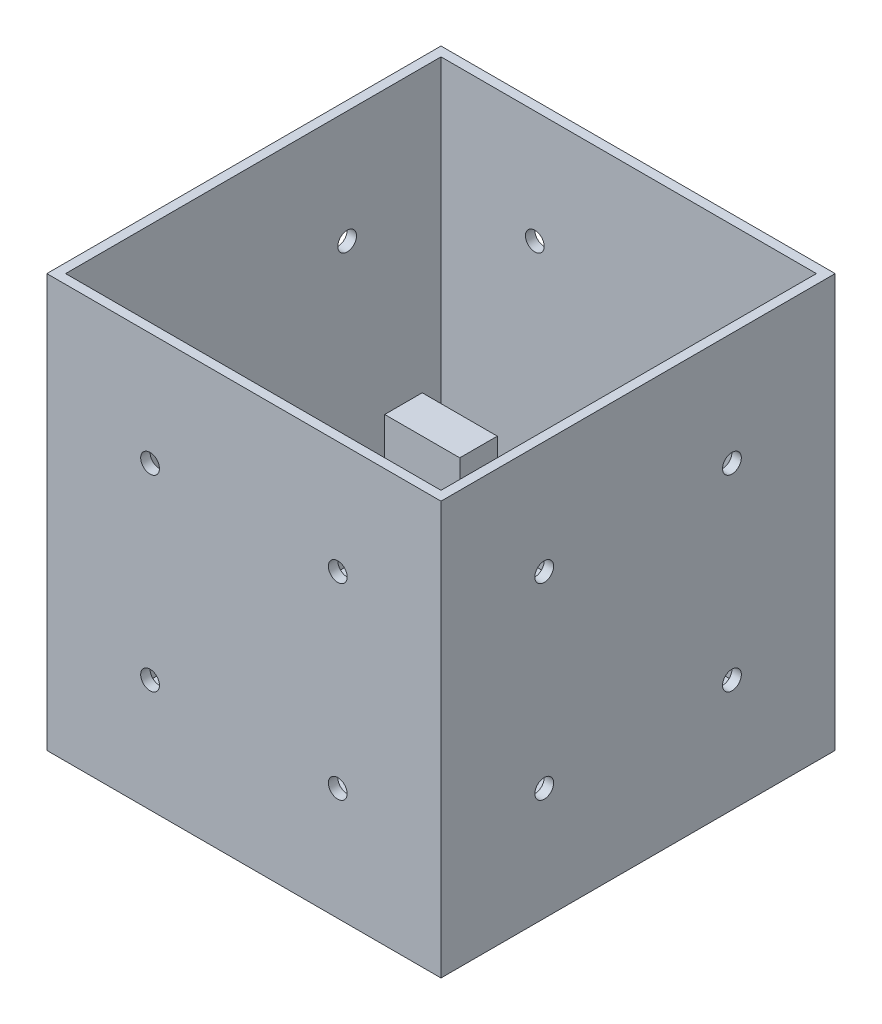
ISO-10303-21;
HEADER;
FILE_DESCRIPTION(('STEP AP214'),'2;1');
FILE_NAME('part.step','',(''),(''),'','','');
FILE_SCHEMA(('AUTOMOTIVE_DESIGN { 1 0 10303 214 1 1 1 1 }'));
ENDSEC;
DATA;
#1=APPLICATION_CONTEXT('core data for automotive mechanical design processes');
#2=APPLICATION_PROTOCOL_DEFINITION('international standard','automotive_design',2000,#1);
#3=PRODUCT_CONTEXT('',#1,'mechanical');
#4=PRODUCT('Part','Part','',(#3));
#5=PRODUCT_RELATED_PRODUCT_CATEGORY('part','',(#4));
#6=PRODUCT_DEFINITION_FORMATION('','',#4);
#7=PRODUCT_DEFINITION_CONTEXT('part definition',#1,'design');
#8=PRODUCT_DEFINITION('design','',#6,#7);
#9=PRODUCT_DEFINITION_SHAPE('','',#8);
#10=(LENGTH_UNIT() NAMED_UNIT(*) SI_UNIT(.MILLI.,.METRE.));
#11=(NAMED_UNIT(*) PLANE_ANGLE_UNIT() SI_UNIT($,.RADIAN.));
#12=(NAMED_UNIT(*) SI_UNIT($,.STERADIAN.) SOLID_ANGLE_UNIT());
#13=UNCERTAINTY_MEASURE_WITH_UNIT(LENGTH_MEASURE(1.E-05),#10,'distance_accuracy_value','');
#14=(GEOMETRIC_REPRESENTATION_CONTEXT(3) GLOBAL_UNCERTAINTY_ASSIGNED_CONTEXT((#13)) GLOBAL_UNIT_ASSIGNED_CONTEXT((#10,
#11,#12)) REPRESENTATION_CONTEXT('',''));
#15=CARTESIAN_POINT('',(0.,0.,0.));
#16=DIRECTION('',(0.,0.,1.));
#17=DIRECTION('',(1.,0.,0.));
#18=AXIS2_PLACEMENT_3D('',#15,#16,#17);
#19=CARTESIAN_POINT('',(0.,5.,0.));
#20=DIRECTION('',(0.,1.,0.));
#21=DIRECTION('',(0.,0.,1.));
#22=AXIS2_PLACEMENT_3D('',#19,#20,#21);
#23=PLANE('',#22);
#24=CARTESIAN_POINT('',(-25.,5.,25.));
#25=DIRECTION('',(0.,-1.,0.));
#26=DIRECTION('',(0.,0.,-1.));
#27=AXIS2_PLACEMENT_3D('',#24,#25,#26);
#28=CIRCLE('',#27,2.5);
#29=CARTESIAN_POINT('',(-25.,5.,22.5));
#30=VERTEX_POINT('',#29);
#31=EDGE_CURVE('E221',#30,#30,#28,.T.);
#32=ORIENTED_EDGE('',*,*,#31,.T.);
#33=EDGE_LOOP('',(#32));
#34=FACE_BOUND('',#33,.T.);
#35=CARTESIAN_POINT('',(25.,5.,25.));
#36=DIRECTION('',(0.,-1.,0.));
#37=DIRECTION('',(0.,0.,-1.));
#38=AXIS2_PLACEMENT_3D('',#35,#36,#37);
#39=CIRCLE('',#38,2.5);
#40=CARTESIAN_POINT('',(25.,5.,22.5));
#41=VERTEX_POINT('',#40);
#42=EDGE_CURVE('E228',#41,#41,#39,.T.);
#43=ORIENTED_EDGE('',*,*,#42,.T.);
#44=EDGE_LOOP('',(#43));
#45=FACE_BOUND('',#44,.T.);
#46=CARTESIAN_POINT('',(25.,5.,-25.));
#47=DIRECTION('',(0.,-1.,0.));
#48=DIRECTION('',(0.,0.,-1.));
#49=AXIS2_PLACEMENT_3D('',#46,#47,#48);
#50=CIRCLE('',#49,2.5);
#51=CARTESIAN_POINT('',(25.,5.,-27.5));
#52=VERTEX_POINT('',#51);
#53=EDGE_CURVE('E234',#52,#52,#50,.T.);
#54=ORIENTED_EDGE('',*,*,#53,.T.);
#55=EDGE_LOOP('',(#54));
#56=FACE_BOUND('',#55,.T.);
#57=CARTESIAN_POINT('',(-25.,5.,-25.));
#58=DIRECTION('',(0.,1.,0.));
#59=DIRECTION('',(0.,0.,1.));
#60=AXIS2_PLACEMENT_3D('',#57,#58,#59);
#61=CIRCLE('',#60,2.5);
#62=CARTESIAN_POINT('',(-25.,5.,-22.5));
#63=VERTEX_POINT('',#62);
#64=EDGE_CURVE('E237',#63,#63,#61,.T.);
#65=ORIENTED_EDGE('',*,*,#64,.F.);
#66=EDGE_LOOP('',(#65));
#67=FACE_BOUND('',#66,.T.);
#68=DIRECTION('',(0.,0.,-1.));
#69=VECTOR('',#68,1.);
#70=CARTESIAN_POINT('',(50.,5.,-50.));
#71=LINE('',#70,#69);
#72=CARTESIAN_POINT('',(50.,5.,50.));
#73=VERTEX_POINT('',#72);
#74=CARTESIAN_POINT('',(50.,5.,-50.));
#75=VERTEX_POINT('',#74);
#76=EDGE_CURVE('E245',#73,#75,#71,.T.);
#77=ORIENTED_EDGE('',*,*,#76,.T.);
#78=DIRECTION('',(-1.,0.,0.));
#79=VECTOR('',#78,1.);
#80=CARTESIAN_POINT('',(-50.,5.,-50.));
#81=LINE('',#80,#79);
#82=CARTESIAN_POINT('',(-50.,5.,-50.));
#83=VERTEX_POINT('',#82);
#84=EDGE_CURVE('E248',#75,#83,#81,.T.);
#85=ORIENTED_EDGE('',*,*,#84,.T.);
#86=DIRECTION('',(0.,0.,1.));
#87=VECTOR('',#86,1.);
#88=CARTESIAN_POINT('',(-50.,5.,-50.));
#89=LINE('',#88,#87);
#90=CARTESIAN_POINT('',(-50.,5.,50.));
#91=VERTEX_POINT('',#90);
#92=EDGE_CURVE('E252',#83,#91,#89,.T.);
#93=ORIENTED_EDGE('',*,*,#92,.T.);
#94=DIRECTION('',(1.,0.,0.));
#95=VECTOR('',#94,1.);
#96=CARTESIAN_POINT('',(-50.,5.,50.));
#97=LINE('',#96,#95);
#98=EDGE_CURVE('E255',#91,#73,#97,.T.);
#99=ORIENTED_EDGE('',*,*,#98,.T.);
#100=EDGE_LOOP('',(#77,#85,#93,#99));
#101=FACE_BOUND('',#100,.T.);
#102=DIRECTION('',(-1.,0.,0.));
#103=VECTOR('',#102,1.);
#104=CARTESIAN_POINT('',(-10.,5.,-5.));
#105=LINE('',#104,#103);
#106=CARTESIAN_POINT('',(10.,5.,-5.));
#107=VERTEX_POINT('',#106);
#108=CARTESIAN_POINT('',(-10.,5.,-5.));
#109=VERTEX_POINT('',#108);
#110=EDGE_CURVE('E441',#107,#109,#105,.T.);
#111=ORIENTED_EDGE('',*,*,#110,.F.);
#112=DIRECTION('',(0.,0.,-1.));
#113=VECTOR('',#112,1.);
#114=CARTESIAN_POINT('',(10.,5.,-5.));
#115=LINE('',#114,#113);
#116=CARTESIAN_POINT('',(10.,5.,5.));
#117=VERTEX_POINT('',#116);
#118=EDGE_CURVE('E152',#117,#107,#115,.T.);
#119=ORIENTED_EDGE('',*,*,#118,.F.);
#120=DIRECTION('',(1.,0.,0.));
#121=VECTOR('',#120,1.);
#122=CARTESIAN_POINT('',(-10.,5.,5.));
#123=LINE('',#122,#121);
#124=CARTESIAN_POINT('',(-10.,5.,5.));
#125=VERTEX_POINT('',#124);
#126=EDGE_CURVE('E148',#125,#117,#123,.T.);
#127=ORIENTED_EDGE('',*,*,#126,.F.);
#128=DIRECTION('',(0.,0.,1.));
#129=VECTOR('',#128,1.);
#130=CARTESIAN_POINT('',(-10.,5.,-5.));
#131=LINE('',#130,#129);
#132=EDGE_CURVE('E443',#109,#125,#131,.T.);
#133=ORIENTED_EDGE('',*,*,#132,.F.);
#134=EDGE_LOOP('',(#111,#119,#127,#133));
#135=FACE_BOUND('',#134,.T.);
#136=ADVANCED_FACE('F38',(#34,#45,#56,#67,#101,#135),#23,.T.);
#137=CARTESIAN_POINT('',(52.5,110.,-52.5));
#138=DIRECTION('',(-1.,0.,0.));
#139=DIRECTION('',(0.,0.,1.));
#140=AXIS2_PLACEMENT_3D('',#137,#138,#139);
#141=PLANE('',#140);
#142=CARTESIAN_POINT('',(52.5,30.,25.));
#143=DIRECTION('',(1.,0.,0.));
#144=DIRECTION('',(0.,0.,-1.));
#145=AXIS2_PLACEMENT_3D('',#142,#143,#144);
#146=CIRCLE('',#145,2.5);
#147=CARTESIAN_POINT('',(52.5,30.,22.5));
#148=VERTEX_POINT('',#147);
#149=EDGE_CURVE('E173',#148,#148,#146,.T.);
#150=ORIENTED_EDGE('',*,*,#149,.F.);
#151=EDGE_LOOP('',(#150));
#152=FACE_BOUND('',#151,.T.);
#153=CARTESIAN_POINT('',(52.5,30.,-25.));
#154=DIRECTION('',(1.,0.,0.));
#155=DIRECTION('',(0.,0.,-1.));
#156=AXIS2_PLACEMENT_3D('',#153,#154,#155);
#157=CIRCLE('',#156,2.5);
#158=CARTESIAN_POINT('',(52.5,30.,-27.5));
#159=VERTEX_POINT('',#158);
#160=EDGE_CURVE('E177',#159,#159,#157,.T.);
#161=ORIENTED_EDGE('',*,*,#160,.F.);
#162=EDGE_LOOP('',(#161));
#163=FACE_BOUND('',#162,.T.);
#164=CARTESIAN_POINT('',(52.5,80.,25.));
#165=DIRECTION('',(1.,0.,0.));
#166=DIRECTION('',(0.,0.,-1.));
#167=AXIS2_PLACEMENT_3D('',#164,#165,#166);
#168=CIRCLE('',#167,2.5);
#169=CARTESIAN_POINT('',(52.5,80.,22.5));
#170=VERTEX_POINT('',#169);
#171=EDGE_CURVE('E181',#170,#170,#168,.T.);
#172=ORIENTED_EDGE('',*,*,#171,.F.);
#173=EDGE_LOOP('',(#172));
#174=FACE_BOUND('',#173,.T.);
#175=CARTESIAN_POINT('',(52.5,80.,-25.));
#176=DIRECTION('',(1.,0.,0.));
#177=DIRECTION('',(0.,0.,-1.));
#178=AXIS2_PLACEMENT_3D('',#175,#176,#177);
#179=CIRCLE('',#178,2.5);
#180=CARTESIAN_POINT('',(52.5,80.,-27.5));
#181=VERTEX_POINT('',#180);
#182=EDGE_CURVE('E185',#181,#181,#179,.T.);
#183=ORIENTED_EDGE('',*,*,#182,.F.);
#184=EDGE_LOOP('',(#183));
#185=FACE_BOUND('',#184,.T.);
#186=DIRECTION('',(0.,0.,-1.));
#187=VECTOR('',#186,1.);
#188=CARTESIAN_POINT('',(52.5,0.,-52.5));
#189=LINE('',#188,#187);
#190=CARTESIAN_POINT('',(52.5,0.,52.5));
#191=VERTEX_POINT('',#190);
#192=CARTESIAN_POINT('',(52.5,0.,-52.5));
#193=VERTEX_POINT('',#192);
#194=EDGE_CURVE('E270',#191,#193,#189,.T.);
#195=ORIENTED_EDGE('',*,*,#194,.T.);
#196=DIRECTION('',(0.,-1.,0.));
#197=VECTOR('',#196,1.);
#198=CARTESIAN_POINT('',(52.5,110.,-52.5));
#199=LINE('',#198,#197);
#200=CARTESIAN_POINT('',(52.5,110.,-52.5));
#201=VERTEX_POINT('',#200);
#202=EDGE_CURVE('E11',#201,#193,#199,.T.);
#203=ORIENTED_EDGE('',*,*,#202,.F.);
#204=DIRECTION('',(0.,0.,-1.));
#205=VECTOR('',#204,1.);
#206=CARTESIAN_POINT('',(52.5,110.,-52.5));
#207=LINE('',#206,#205);
#208=CARTESIAN_POINT('',(52.5,110.,52.5));
#209=VERTEX_POINT('',#208);
#210=EDGE_CURVE('E276',#209,#201,#207,.T.);
#211=ORIENTED_EDGE('',*,*,#210,.F.);
#212=DIRECTION('',(0.,-1.,0.));
#213=VECTOR('',#212,1.);
#214=CARTESIAN_POINT('',(52.5,110.,52.5));
#215=LINE('',#214,#213);
#216=EDGE_CURVE('E286',#209,#191,#215,.T.);
#217=ORIENTED_EDGE('',*,*,#216,.T.);
#218=EDGE_LOOP('',(#195,#203,#211,#217));
#219=FACE_BOUND('',#218,.T.);
#220=ADVANCED_FACE('F40',(#152,#163,#174,#185,#219),#141,.F.);
#221=CARTESIAN_POINT('',(-52.5,110.,-52.5));
#222=DIRECTION('',(0.,0.,1.));
#223=DIRECTION('',(1.,0.,0.));
#224=AXIS2_PLACEMENT_3D('',#221,#222,#223);
#225=PLANE('',#224);
#226=CARTESIAN_POINT('',(25.,30.,-52.5));
#227=DIRECTION('',(0.,0.,-1.));
#228=DIRECTION('',(-1.,0.,0.));
#229=AXIS2_PLACEMENT_3D('',#226,#227,#228);
#230=CIRCLE('',#229,2.5);
#231=CARTESIAN_POINT('',(22.5,30.,-52.5));
#232=VERTEX_POINT('',#231);
#233=EDGE_CURVE('E189',#232,#232,#230,.T.);
#234=ORIENTED_EDGE('',*,*,#233,.F.);
#235=EDGE_LOOP('',(#234));
#236=FACE_BOUND('',#235,.T.);
#237=CARTESIAN_POINT('',(25.,80.,-52.5));
#238=DIRECTION('',(0.,0.,-1.));
#239=DIRECTION('',(-1.,0.,0.));
#240=AXIS2_PLACEMENT_3D('',#237,#238,#239);
#241=CIRCLE('',#240,2.5);
#242=CARTESIAN_POINT('',(22.5,80.,-52.5));
#243=VERTEX_POINT('',#242);
#244=EDGE_CURVE('E193',#243,#243,#241,.T.);
#245=ORIENTED_EDGE('',*,*,#244,.F.);
#246=EDGE_LOOP('',(#245));
#247=FACE_BOUND('',#246,.T.);
#248=CARTESIAN_POINT('',(-25.,30.,-52.5));
#249=DIRECTION('',(0.,0.,-1.));
#250=DIRECTION('',(-1.,0.,0.));
#251=AXIS2_PLACEMENT_3D('',#248,#249,#250);
#252=CIRCLE('',#251,2.5);
#253=CARTESIAN_POINT('',(-27.5,30.,-52.5));
#254=VERTEX_POINT('',#253);
#255=EDGE_CURVE('E197',#254,#254,#252,.T.);
#256=ORIENTED_EDGE('',*,*,#255,.F.);
#257=EDGE_LOOP('',(#256));
#258=FACE_BOUND('',#257,.T.);
#259=CARTESIAN_POINT('',(-25.,80.,-52.5));
#260=DIRECTION('',(0.,0.,-1.));
#261=DIRECTION('',(-1.,0.,0.));
#262=AXIS2_PLACEMENT_3D('',#259,#260,#261);
#263=CIRCLE('',#262,2.5);
#264=CARTESIAN_POINT('',(-27.5,80.,-52.5));
#265=VERTEX_POINT('',#264);
#266=EDGE_CURVE('E201',#265,#265,#263,.T.);
#267=ORIENTED_EDGE('',*,*,#266,.F.);
#268=EDGE_LOOP('',(#267));
#269=FACE_BOUND('',#268,.T.);
#270=DIRECTION('',(-1.,0.,0.));
#271=VECTOR('',#270,1.);
#272=CARTESIAN_POINT('',(-52.5,0.,-52.5));
#273=LINE('',#272,#271);
#274=CARTESIAN_POINT('',(-52.5,0.,-52.5));
#275=VERTEX_POINT('',#274);
#276=EDGE_CURVE('E289',#193,#275,#273,.T.);
#277=ORIENTED_EDGE('',*,*,#276,.T.);
#278=DIRECTION('',(0.,-1.,0.));
#279=VECTOR('',#278,1.);
#280=CARTESIAN_POINT('',(-52.5,110.,-52.5));
#281=LINE('',#280,#279);
#282=CARTESIAN_POINT('',(-52.5,110.,-52.5));
#283=VERTEX_POINT('',#282);
#284=EDGE_CURVE('E47',#283,#275,#281,.T.);
#285=ORIENTED_EDGE('',*,*,#284,.F.);
#286=DIRECTION('',(-1.,0.,0.));
#287=VECTOR('',#286,1.);
#288=CARTESIAN_POINT('',(-52.5,110.,-52.5));
#289=LINE('',#288,#287);
#290=EDGE_CURVE('E279',#201,#283,#289,.T.);
#291=ORIENTED_EDGE('',*,*,#290,.F.);
#292=ORIENTED_EDGE('',*,*,#202,.T.);
#293=EDGE_LOOP('',(#277,#285,#291,#292));
#294=FACE_BOUND('',#293,.T.);
#295=ADVANCED_FACE('F355',(#236,#247,#258,#269,#294),#225,.F.);
#296=CARTESIAN_POINT('',(-52.5,110.,-52.5));
#297=DIRECTION('',(1.,0.,0.));
#298=DIRECTION('',(0.,0.,-1.));
#299=AXIS2_PLACEMENT_3D('',#296,#297,#298);
#300=PLANE('',#299);
#301=CARTESIAN_POINT('',(-52.5,30.,25.));
#302=DIRECTION('',(-1.,0.,0.));
#303=DIRECTION('',(0.,0.,1.));
#304=AXIS2_PLACEMENT_3D('',#301,#302,#303);
#305=CIRCLE('',#304,2.5);
#306=CARTESIAN_POINT('',(-52.5,30.,27.5));
#307=VERTEX_POINT('',#306);
#308=EDGE_CURVE('E205',#307,#307,#305,.T.);
#309=ORIENTED_EDGE('',*,*,#308,.F.);
#310=EDGE_LOOP('',(#309));
#311=FACE_BOUND('',#310,.T.);
#312=CARTESIAN_POINT('',(-52.5,80.,25.));
#313=DIRECTION('',(-1.,0.,0.));
#314=DIRECTION('',(0.,0.,1.));
#315=AXIS2_PLACEMENT_3D('',#312,#313,#314);
#316=CIRCLE('',#315,2.5);
#317=CARTESIAN_POINT('',(-52.5,80.,27.5));
#318=VERTEX_POINT('',#317);
#319=EDGE_CURVE('E209',#318,#318,#316,.T.);
#320=ORIENTED_EDGE('',*,*,#319,.F.);
#321=EDGE_LOOP('',(#320));
#322=FACE_BOUND('',#321,.T.);
#323=CARTESIAN_POINT('',(-52.5,30.,-25.));
#324=DIRECTION('',(-1.,0.,0.));
#325=DIRECTION('',(0.,0.,1.));
#326=AXIS2_PLACEMENT_3D('',#323,#324,#325);
#327=CIRCLE('',#326,2.5);
#328=CARTESIAN_POINT('',(-52.5,30.,-22.5));
#329=VERTEX_POINT('',#328);
#330=EDGE_CURVE('E213',#329,#329,#327,.T.);
#331=ORIENTED_EDGE('',*,*,#330,.F.);
#332=EDGE_LOOP('',(#331));
#333=FACE_BOUND('',#332,.T.);
#334=CARTESIAN_POINT('',(-52.5,80.,-25.));
#335=DIRECTION('',(-1.,0.,0.));
#336=DIRECTION('',(0.,0.,1.));
#337=AXIS2_PLACEMENT_3D('',#334,#335,#336);
#338=CIRCLE('',#337,2.5);
#339=CARTESIAN_POINT('',(-52.5,80.,-22.5));
#340=VERTEX_POINT('',#339);
#341=EDGE_CURVE('E217',#340,#340,#338,.T.);
#342=ORIENTED_EDGE('',*,*,#341,.F.);
#343=EDGE_LOOP('',(#342));
#344=FACE_BOUND('',#343,.T.);
#345=DIRECTION('',(0.,0.,1.));
#346=VECTOR('',#345,1.);
#347=CARTESIAN_POINT('',(-52.5,0.,-52.5));
#348=LINE('',#347,#346);
#349=CARTESIAN_POINT('',(-52.5,0.,52.5));
#350=VERTEX_POINT('',#349);
#351=EDGE_CURVE('E291',#275,#350,#348,.T.);
#352=ORIENTED_EDGE('',*,*,#351,.T.);
#353=DIRECTION('',(0.,-1.,0.));
#354=VECTOR('',#353,1.);
#355=CARTESIAN_POINT('',(-52.5,110.,52.5));
#356=LINE('',#355,#354);
#357=CARTESIAN_POINT('',(-52.5,110.,52.5));
#358=VERTEX_POINT('',#357);
#359=EDGE_CURVE('E296',#358,#350,#356,.T.);
#360=ORIENTED_EDGE('',*,*,#359,.F.);
#361=DIRECTION('',(0.,0.,1.));
#362=VECTOR('',#361,1.);
#363=CARTESIAN_POINT('',(-52.5,110.,-52.5));
#364=LINE('',#363,#362);
#365=EDGE_CURVE('E282',#283,#358,#364,.T.);
#366=ORIENTED_EDGE('',*,*,#365,.F.);
#367=ORIENTED_EDGE('',*,*,#284,.T.);
#368=EDGE_LOOP('',(#352,#360,#366,#367));
#369=FACE_BOUND('',#368,.T.);
#370=ADVANCED_FACE('F388',(#311,#322,#333,#344,#369),#300,.F.);
#371=CARTESIAN_POINT('',(-52.5,110.,52.5));
#372=DIRECTION('',(0.,0.,-1.));
#373=DIRECTION('',(-1.,0.,0.));
#374=AXIS2_PLACEMENT_3D('',#371,#372,#373);
#375=PLANE('',#374);
#376=CARTESIAN_POINT('',(25.,30.,52.5));
#377=DIRECTION('',(0.,0.,1.));
#378=DIRECTION('',(1.,0.,0.));
#379=AXIS2_PLACEMENT_3D('',#376,#377,#378);
#380=CIRCLE('',#379,2.5);
#381=CARTESIAN_POINT('',(27.5,30.,52.5));
#382=VERTEX_POINT('',#381);
#383=EDGE_CURVE('E154',#382,#382,#380,.T.);
#384=ORIENTED_EDGE('',*,*,#383,.F.);
#385=EDGE_LOOP('',(#384));
#386=FACE_BOUND('',#385,.T.);
#387=CARTESIAN_POINT('',(-25.,30.,52.5));
#388=DIRECTION('',(0.,0.,1.));
#389=DIRECTION('',(1.,0.,0.));
#390=AXIS2_PLACEMENT_3D('',#387,#388,#389);
#391=CIRCLE('',#390,2.5);
#392=CARTESIAN_POINT('',(-22.5,30.,52.5));
#393=VERTEX_POINT('',#392);
#394=EDGE_CURVE('E161',#393,#393,#391,.T.);
#395=ORIENTED_EDGE('',*,*,#394,.F.);
#396=EDGE_LOOP('',(#395));
#397=FACE_BOUND('',#396,.T.);
#398=CARTESIAN_POINT('',(25.,80.,52.5));
#399=DIRECTION('',(0.,0.,1.));
#400=DIRECTION('',(1.,0.,0.));
#401=AXIS2_PLACEMENT_3D('',#398,#399,#400);
#402=CIRCLE('',#401,2.5);
#403=CARTESIAN_POINT('',(27.5,80.,52.5));
#404=VERTEX_POINT('',#403);
#405=EDGE_CURVE('E165',#404,#404,#402,.T.);
#406=ORIENTED_EDGE('',*,*,#405,.F.);
#407=EDGE_LOOP('',(#406));
#408=FACE_BOUND('',#407,.T.);
#409=CARTESIAN_POINT('',(-25.,80.,52.5));
#410=DIRECTION('',(0.,0.,1.));
#411=DIRECTION('',(1.,0.,0.));
#412=AXIS2_PLACEMENT_3D('',#409,#410,#411);
#413=CIRCLE('',#412,2.5);
#414=CARTESIAN_POINT('',(-22.5,80.,52.5));
#415=VERTEX_POINT('',#414);
#416=EDGE_CURVE('E169',#415,#415,#413,.T.);
#417=ORIENTED_EDGE('',*,*,#416,.F.);
#418=EDGE_LOOP('',(#417));
#419=FACE_BOUND('',#418,.T.);
#420=DIRECTION('',(1.,0.,0.));
#421=VECTOR('',#420,1.);
#422=CARTESIAN_POINT('',(-52.5,0.,52.5));
#423=LINE('',#422,#421);
#424=EDGE_CURVE('E280',#350,#191,#423,.T.);
#425=ORIENTED_EDGE('',*,*,#424,.T.);
#426=ORIENTED_EDGE('',*,*,#216,.F.);
#427=DIRECTION('',(1.,0.,0.));
#428=VECTOR('',#427,1.);
#429=CARTESIAN_POINT('',(-52.5,110.,52.5));
#430=LINE('',#429,#428);
#431=EDGE_CURVE('E284',#358,#209,#430,.T.);
#432=ORIENTED_EDGE('',*,*,#431,.F.);
#433=ORIENTED_EDGE('',*,*,#359,.T.);
#434=EDGE_LOOP('',(#425,#426,#432,#433));
#435=FACE_BOUND('',#434,.T.);
#436=ADVANCED_FACE('F381',(#386,#397,#408,#419,#435),#375,.F.);
#437=CARTESIAN_POINT('',(0.,110.,0.));
#438=DIRECTION('',(0.,1.,0.));
#439=DIRECTION('',(0.,0.,1.));
#440=AXIS2_PLACEMENT_3D('',#437,#438,#439);
#441=PLANE('',#440);
#442=DIRECTION('',(0.,0.,-1.));
#443=VECTOR('',#442,1.);
#444=CARTESIAN_POINT('',(50.,110.,-50.));
#445=LINE('',#444,#443);
#446=CARTESIAN_POINT('',(50.,110.,50.));
#447=VERTEX_POINT('',#446);
#448=CARTESIAN_POINT('',(50.,110.,-50.));
#449=VERTEX_POINT('',#448);
#450=EDGE_CURVE('E63',#447,#449,#445,.T.);
#451=ORIENTED_EDGE('',*,*,#450,.F.);
#452=DIRECTION('',(1.,0.,0.));
#453=VECTOR('',#452,1.);
#454=CARTESIAN_POINT('',(-50.,110.,50.));
#455=LINE('',#454,#453);
#456=CARTESIAN_POINT('',(-50.,110.,50.));
#457=VERTEX_POINT('',#456);
#458=EDGE_CURVE('E249',#457,#447,#455,.T.);
#459=ORIENTED_EDGE('',*,*,#458,.F.);
#460=DIRECTION('',(0.,0.,1.));
#461=VECTOR('',#460,1.);
#462=CARTESIAN_POINT('',(-50.,110.,-50.));
#463=LINE('',#462,#461);
#464=CARTESIAN_POINT('',(-50.,110.,-50.));
#465=VERTEX_POINT('',#464);
#466=EDGE_CURVE('E263',#465,#457,#463,.T.);
#467=ORIENTED_EDGE('',*,*,#466,.F.);
#468=DIRECTION('',(-1.,0.,0.));
#469=VECTOR('',#468,1.);
#470=CARTESIAN_POINT('',(-50.,110.,-50.));
#471=LINE('',#470,#469);
#472=EDGE_CURVE('E260',#449,#465,#471,.T.);
#473=ORIENTED_EDGE('',*,*,#472,.F.);
#474=EDGE_LOOP('',(#451,#459,#467,#473));
#475=FACE_BOUND('',#474,.T.);
#476=ORIENTED_EDGE('',*,*,#210,.T.);
#477=ORIENTED_EDGE('',*,*,#290,.T.);
#478=ORIENTED_EDGE('',*,*,#365,.T.);
#479=ORIENTED_EDGE('',*,*,#431,.T.);
#480=EDGE_LOOP('',(#476,#477,#478,#479));
#481=FACE_BOUND('',#480,.T.);
#482=ADVANCED_FACE('F378',(#475,#481),#441,.T.);
#483=CARTESIAN_POINT('',(0.,0.,0.));
#484=DIRECTION('',(0.,1.,0.));
#485=DIRECTION('',(0.,0.,1.));
#486=AXIS2_PLACEMENT_3D('',#483,#484,#485);
#487=PLANE('',#486);
#488=CARTESIAN_POINT('',(-25.,0.,25.));
#489=DIRECTION('',(0.,-1.,0.));
#490=DIRECTION('',(0.,0.,-1.));
#491=AXIS2_PLACEMENT_3D('',#488,#489,#490);
#492=CIRCLE('',#491,2.5);
#493=CARTESIAN_POINT('',(-25.,0.,22.5));
#494=VERTEX_POINT('',#493);
#495=EDGE_CURVE('E225',#494,#494,#492,.T.);
#496=ORIENTED_EDGE('',*,*,#495,.F.);
#497=EDGE_LOOP('',(#496));
#498=FACE_BOUND('',#497,.T.);
#499=CARTESIAN_POINT('',(25.,0.,25.));
#500=DIRECTION('',(0.,-1.,0.));
#501=DIRECTION('',(0.,0.,-1.));
#502=AXIS2_PLACEMENT_3D('',#499,#500,#501);
#503=CIRCLE('',#502,2.5);
#504=CARTESIAN_POINT('',(25.,0.,22.5));
#505=VERTEX_POINT('',#504);
#506=EDGE_CURVE('E224',#505,#505,#503,.T.);
#507=ORIENTED_EDGE('',*,*,#506,.F.);
#508=EDGE_LOOP('',(#507));
#509=FACE_BOUND('',#508,.T.);
#510=CARTESIAN_POINT('',(25.,0.,-25.));
#511=DIRECTION('',(0.,-1.,0.));
#512=DIRECTION('',(0.,0.,-1.));
#513=AXIS2_PLACEMENT_3D('',#510,#511,#512);
#514=CIRCLE('',#513,2.5);
#515=CARTESIAN_POINT('',(25.,0.,-27.5));
#516=VERTEX_POINT('',#515);
#517=EDGE_CURVE('E231',#516,#516,#514,.T.);
#518=ORIENTED_EDGE('',*,*,#517,.F.);
#519=EDGE_LOOP('',(#518));
#520=FACE_BOUND('',#519,.T.);
#521=CARTESIAN_POINT('',(-25.,0.,-25.));
#522=DIRECTION('',(0.,1.,0.));
#523=DIRECTION('',(0.,0.,1.));
#524=AXIS2_PLACEMENT_3D('',#521,#522,#523);
#525=CIRCLE('',#524,2.5);
#526=CARTESIAN_POINT('',(-25.,0.,-22.5));
#527=VERTEX_POINT('',#526);
#528=EDGE_CURVE('E240',#527,#527,#525,.T.);
#529=ORIENTED_EDGE('',*,*,#528,.T.);
#530=EDGE_LOOP('',(#529));
#531=FACE_BOUND('',#530,.T.);
#532=ORIENTED_EDGE('',*,*,#194,.F.);
#533=ORIENTED_EDGE('',*,*,#424,.F.);
#534=ORIENTED_EDGE('',*,*,#351,.F.);
#535=ORIENTED_EDGE('',*,*,#276,.F.);
#536=EDGE_LOOP('',(#532,#533,#534,#535));
#537=FACE_BOUND('',#536,.T.);
#538=ADVANCED_FACE('F376',(#498,#509,#520,#531,#537),#487,.F.);
#539=CARTESIAN_POINT('',(50.,5.,-50.));
#540=DIRECTION('',(1.,0.,0.));
#541=DIRECTION('',(0.,0.,-1.));
#542=AXIS2_PLACEMENT_3D('',#539,#540,#541);
#543=PLANE('',#542);
#544=CARTESIAN_POINT('',(50.,30.,25.));
#545=DIRECTION('',(1.,0.,0.));
#546=DIRECTION('',(0.,0.,-1.));
#547=AXIS2_PLACEMENT_3D('',#544,#545,#546);
#548=CIRCLE('',#547,2.5);
#549=CARTESIAN_POINT('',(50.,30.,22.5));
#550=VERTEX_POINT('',#549);
#551=EDGE_CURVE('E176',#550,#550,#548,.T.);
#552=ORIENTED_EDGE('',*,*,#551,.T.);
#553=EDGE_LOOP('',(#552));
#554=FACE_BOUND('',#553,.T.);
#555=CARTESIAN_POINT('',(50.,30.,-25.));
#556=DIRECTION('',(1.,0.,0.));
#557=DIRECTION('',(0.,0.,-1.));
#558=AXIS2_PLACEMENT_3D('',#555,#556,#557);
#559=CIRCLE('',#558,2.5);
#560=CARTESIAN_POINT('',(50.,30.,-27.5));
#561=VERTEX_POINT('',#560);
#562=EDGE_CURVE('E180',#561,#561,#559,.T.);
#563=ORIENTED_EDGE('',*,*,#562,.T.);
#564=EDGE_LOOP('',(#563));
#565=FACE_BOUND('',#564,.T.);
#566=CARTESIAN_POINT('',(50.,80.,25.));
#567=DIRECTION('',(1.,0.,0.));
#568=DIRECTION('',(0.,0.,-1.));
#569=AXIS2_PLACEMENT_3D('',#566,#567,#568);
#570=CIRCLE('',#569,2.5);
#571=CARTESIAN_POINT('',(50.,80.,22.5));
#572=VERTEX_POINT('',#571);
#573=EDGE_CURVE('E184',#572,#572,#570,.T.);
#574=ORIENTED_EDGE('',*,*,#573,.T.);
#575=EDGE_LOOP('',(#574));
#576=FACE_BOUND('',#575,.T.);
#577=CARTESIAN_POINT('',(50.,80.,-25.));
#578=DIRECTION('',(1.,0.,0.));
#579=DIRECTION('',(0.,0.,-1.));
#580=AXIS2_PLACEMENT_3D('',#577,#578,#579);
#581=CIRCLE('',#580,2.5);
#582=CARTESIAN_POINT('',(50.,80.,-27.5));
#583=VERTEX_POINT('',#582);
#584=EDGE_CURVE('E188',#583,#583,#581,.T.);
#585=ORIENTED_EDGE('',*,*,#584,.T.);
#586=EDGE_LOOP('',(#585));
#587=FACE_BOUND('',#586,.T.);
#588=ORIENTED_EDGE('',*,*,#450,.T.);
#589=DIRECTION('',(0.,1.,0.));
#590=VECTOR('',#589,1.);
#591=CARTESIAN_POINT('',(50.,5.,-50.));
#592=LINE('',#591,#590);
#593=EDGE_CURVE('E258',#75,#449,#592,.T.);
#594=ORIENTED_EDGE('',*,*,#593,.F.);
#595=ORIENTED_EDGE('',*,*,#76,.F.);
#596=DIRECTION('',(0.,1.,0.));
#597=VECTOR('',#596,1.);
#598=CARTESIAN_POINT('',(50.,5.,50.));
#599=LINE('',#598,#597);
#600=EDGE_CURVE('E268',#73,#447,#599,.T.);
#601=ORIENTED_EDGE('',*,*,#600,.T.);
#602=EDGE_LOOP('',(#588,#594,#595,#601));
#603=FACE_BOUND('',#602,.T.);
#604=ADVANCED_FACE('F365',(#554,#565,#576,#587,#603),#543,.F.);
#605=CARTESIAN_POINT('',(-50.,5.,50.));
#606=DIRECTION('',(0.,0.,1.));
#607=DIRECTION('',(1.,0.,0.));
#608=AXIS2_PLACEMENT_3D('',#605,#606,#607);
#609=PLANE('',#608);
#610=CARTESIAN_POINT('',(25.,30.,50.));
#611=DIRECTION('',(0.,0.,1.));
#612=DIRECTION('',(1.,0.,0.));
#613=AXIS2_PLACEMENT_3D('',#610,#611,#612);
#614=CIRCLE('',#613,2.5);
#615=CARTESIAN_POINT('',(27.5,30.,50.));
#616=VERTEX_POINT('',#615);
#617=EDGE_CURVE('E42',#616,#616,#614,.T.);
#618=ORIENTED_EDGE('',*,*,#617,.T.);
#619=EDGE_LOOP('',(#618));
#620=FACE_BOUND('',#619,.T.);
#621=CARTESIAN_POINT('',(-25.,30.,50.));
#622=DIRECTION('',(0.,0.,1.));
#623=DIRECTION('',(1.,0.,0.));
#624=AXIS2_PLACEMENT_3D('',#621,#622,#623);
#625=CIRCLE('',#624,2.5);
#626=CARTESIAN_POINT('',(-22.5,30.,50.));
#627=VERTEX_POINT('',#626);
#628=EDGE_CURVE('E164',#627,#627,#625,.T.);
#629=ORIENTED_EDGE('',*,*,#628,.T.);
#630=EDGE_LOOP('',(#629));
#631=FACE_BOUND('',#630,.T.);
#632=CARTESIAN_POINT('',(25.,80.,50.));
#633=DIRECTION('',(0.,0.,1.));
#634=DIRECTION('',(1.,0.,0.));
#635=AXIS2_PLACEMENT_3D('',#632,#633,#634);
#636=CIRCLE('',#635,2.5);
#637=CARTESIAN_POINT('',(27.5,80.,50.));
#638=VERTEX_POINT('',#637);
#639=EDGE_CURVE('E168',#638,#638,#636,.T.);
#640=ORIENTED_EDGE('',*,*,#639,.T.);
#641=EDGE_LOOP('',(#640));
#642=FACE_BOUND('',#641,.T.);
#643=CARTESIAN_POINT('',(-25.,80.,50.));
#644=DIRECTION('',(0.,0.,1.));
#645=DIRECTION('',(1.,0.,0.));
#646=AXIS2_PLACEMENT_3D('',#643,#644,#645);
#647=CIRCLE('',#646,2.5);
#648=CARTESIAN_POINT('',(-22.5,80.,50.));
#649=VERTEX_POINT('',#648);
#650=EDGE_CURVE('E172',#649,#649,#647,.T.);
#651=ORIENTED_EDGE('',*,*,#650,.T.);
#652=EDGE_LOOP('',(#651));
#653=FACE_BOUND('',#652,.T.);
#654=ORIENTED_EDGE('',*,*,#458,.T.);
#655=ORIENTED_EDGE('',*,*,#600,.F.);
#656=ORIENTED_EDGE('',*,*,#98,.F.);
#657=DIRECTION('',(0.,1.,0.));
#658=VECTOR('',#657,1.);
#659=CARTESIAN_POINT('',(-50.,5.,50.));
#660=LINE('',#659,#658);
#661=EDGE_CURVE('E271',#91,#457,#660,.T.);
#662=ORIENTED_EDGE('',*,*,#661,.T.);
#663=EDGE_LOOP('',(#654,#655,#656,#662));
#664=FACE_BOUND('',#663,.T.);
#665=ADVANCED_FACE('F331',(#620,#631,#642,#653,#664),#609,.F.);
#666=CARTESIAN_POINT('',(-50.,5.,-50.));
#667=DIRECTION('',(-1.,0.,0.));
#668=DIRECTION('',(0.,0.,1.));
#669=AXIS2_PLACEMENT_3D('',#666,#667,#668);
#670=PLANE('',#669);
#671=CARTESIAN_POINT('',(-50.,30.,25.));
#672=DIRECTION('',(-1.,0.,0.));
#673=DIRECTION('',(0.,0.,1.));
#674=AXIS2_PLACEMENT_3D('',#671,#672,#673);
#675=CIRCLE('',#674,2.5);
#676=CARTESIAN_POINT('',(-50.,30.,27.5));
#677=VERTEX_POINT('',#676);
#678=EDGE_CURVE('E208',#677,#677,#675,.T.);
#679=ORIENTED_EDGE('',*,*,#678,.T.);
#680=EDGE_LOOP('',(#679));
#681=FACE_BOUND('',#680,.T.);
#682=CARTESIAN_POINT('',(-50.,80.,25.));
#683=DIRECTION('',(-1.,0.,0.));
#684=DIRECTION('',(0.,0.,1.));
#685=AXIS2_PLACEMENT_3D('',#682,#683,#684);
#686=CIRCLE('',#685,2.5);
#687=CARTESIAN_POINT('',(-50.,80.,27.5));
#688=VERTEX_POINT('',#687);
#689=EDGE_CURVE('E212',#688,#688,#686,.T.);
#690=ORIENTED_EDGE('',*,*,#689,.T.);
#691=EDGE_LOOP('',(#690));
#692=FACE_BOUND('',#691,.T.);
#693=CARTESIAN_POINT('',(-50.,30.,-25.));
#694=DIRECTION('',(-1.,0.,0.));
#695=DIRECTION('',(0.,0.,1.));
#696=AXIS2_PLACEMENT_3D('',#693,#694,#695);
#697=CIRCLE('',#696,2.5);
#698=CARTESIAN_POINT('',(-50.,30.,-22.5));
#699=VERTEX_POINT('',#698);
#700=EDGE_CURVE('E216',#699,#699,#697,.T.);
#701=ORIENTED_EDGE('',*,*,#700,.T.);
#702=EDGE_LOOP('',(#701));
#703=FACE_BOUND('',#702,.T.);
#704=CARTESIAN_POINT('',(-50.,80.,-25.));
#705=DIRECTION('',(-1.,0.,0.));
#706=DIRECTION('',(0.,0.,1.));
#707=AXIS2_PLACEMENT_3D('',#704,#705,#706);
#708=CIRCLE('',#707,2.5);
#709=CARTESIAN_POINT('',(-50.,80.,-22.5));
#710=VERTEX_POINT('',#709);
#711=EDGE_CURVE('E220',#710,#710,#708,.T.);
#712=ORIENTED_EDGE('',*,*,#711,.T.);
#713=EDGE_LOOP('',(#712));
#714=FACE_BOUND('',#713,.T.);
#715=ORIENTED_EDGE('',*,*,#466,.T.);
#716=ORIENTED_EDGE('',*,*,#661,.F.);
#717=ORIENTED_EDGE('',*,*,#92,.F.);
#718=DIRECTION('',(0.,1.,0.));
#719=VECTOR('',#718,1.);
#720=CARTESIAN_POINT('',(-50.,5.,-50.));
#721=LINE('',#720,#719);
#722=EDGE_CURVE('E273',#83,#465,#721,.T.);
#723=ORIENTED_EDGE('',*,*,#722,.T.);
#724=EDGE_LOOP('',(#715,#716,#717,#723));
#725=FACE_BOUND('',#724,.T.);
#726=ADVANCED_FACE('F364',(#681,#692,#703,#714,#725),#670,.F.);
#727=CARTESIAN_POINT('',(-50.,5.,-50.));
#728=DIRECTION('',(0.,0.,-1.));
#729=DIRECTION('',(-1.,0.,0.));
#730=AXIS2_PLACEMENT_3D('',#727,#728,#729);
#731=PLANE('',#730);
#732=CARTESIAN_POINT('',(25.,30.,-50.));
#733=DIRECTION('',(0.,0.,-1.));
#734=DIRECTION('',(-1.,0.,0.));
#735=AXIS2_PLACEMENT_3D('',#732,#733,#734);
#736=CIRCLE('',#735,2.5);
#737=CARTESIAN_POINT('',(22.5,30.,-50.));
#738=VERTEX_POINT('',#737);
#739=EDGE_CURVE('E192',#738,#738,#736,.T.);
#740=ORIENTED_EDGE('',*,*,#739,.T.);
#741=EDGE_LOOP('',(#740));
#742=FACE_BOUND('',#741,.T.);
#743=CARTESIAN_POINT('',(25.,80.,-50.));
#744=DIRECTION('',(0.,0.,-1.));
#745=DIRECTION('',(-1.,0.,0.));
#746=AXIS2_PLACEMENT_3D('',#743,#744,#745);
#747=CIRCLE('',#746,2.5);
#748=CARTESIAN_POINT('',(22.5,80.,-50.));
#749=VERTEX_POINT('',#748);
#750=EDGE_CURVE('E196',#749,#749,#747,.T.);
#751=ORIENTED_EDGE('',*,*,#750,.T.);
#752=EDGE_LOOP('',(#751));
#753=FACE_BOUND('',#752,.T.);
#754=CARTESIAN_POINT('',(-25.,30.,-50.));
#755=DIRECTION('',(0.,0.,-1.));
#756=DIRECTION('',(-1.,0.,0.));
#757=AXIS2_PLACEMENT_3D('',#754,#755,#756);
#758=CIRCLE('',#757,2.5);
#759=CARTESIAN_POINT('',(-27.5,30.,-50.));
#760=VERTEX_POINT('',#759);
#761=EDGE_CURVE('E200',#760,#760,#758,.T.);
#762=ORIENTED_EDGE('',*,*,#761,.T.);
#763=EDGE_LOOP('',(#762));
#764=FACE_BOUND('',#763,.T.);
#765=CARTESIAN_POINT('',(-25.,80.,-50.));
#766=DIRECTION('',(0.,0.,-1.));
#767=DIRECTION('',(-1.,0.,0.));
#768=AXIS2_PLACEMENT_3D('',#765,#766,#767);
#769=CIRCLE('',#768,2.5);
#770=CARTESIAN_POINT('',(-27.5,80.,-50.));
#771=VERTEX_POINT('',#770);
#772=EDGE_CURVE('E204',#771,#771,#769,.T.);
#773=ORIENTED_EDGE('',*,*,#772,.T.);
#774=EDGE_LOOP('',(#773));
#775=FACE_BOUND('',#774,.T.);
#776=ORIENTED_EDGE('',*,*,#472,.T.);
#777=ORIENTED_EDGE('',*,*,#722,.F.);
#778=ORIENTED_EDGE('',*,*,#84,.F.);
#779=ORIENTED_EDGE('',*,*,#593,.T.);
#780=EDGE_LOOP('',(#776,#777,#778,#779));
#781=FACE_BOUND('',#780,.T.);
#782=ADVANCED_FACE('F369',(#742,#753,#764,#775,#781),#731,.F.);
#783=CARTESIAN_POINT('',(-25.,0.,-25.));
#784=DIRECTION('',(0.,1.,0.));
#785=DIRECTION('',(0.,0.,1.));
#786=AXIS2_PLACEMENT_3D('',#783,#784,#785);
#787=CYLINDRICAL_SURFACE('',#786,2.5);
#788=ORIENTED_EDGE('',*,*,#528,.F.);
#789=EDGE_LOOP('',(#788));
#790=FACE_BOUND('',#789,.T.);
#791=ORIENTED_EDGE('',*,*,#64,.T.);
#792=EDGE_LOOP('',(#791));
#793=FACE_BOUND('',#792,.T.);
#794=ADVANCED_FACE('F360',(#790,#793),#787,.F.);
#795=CARTESIAN_POINT('',(25.,5.,-25.));
#796=DIRECTION('',(0.,-1.,0.));
#797=DIRECTION('',(0.,0.,-1.));
#798=AXIS2_PLACEMENT_3D('',#795,#796,#797);
#799=CYLINDRICAL_SURFACE('',#798,2.5);
#800=ORIENTED_EDGE('',*,*,#53,.F.);
#801=EDGE_LOOP('',(#800));
#802=FACE_BOUND('',#801,.T.);
#803=ORIENTED_EDGE('',*,*,#517,.T.);
#804=EDGE_LOOP('',(#803));
#805=FACE_BOUND('',#804,.T.);
#806=ADVANCED_FACE('F648',(#802,#805),#799,.F.);
#807=CARTESIAN_POINT('',(25.,5.,25.));
#808=DIRECTION('',(0.,-1.,0.));
#809=DIRECTION('',(0.,0.,-1.));
#810=AXIS2_PLACEMENT_3D('',#807,#808,#809);
#811=CYLINDRICAL_SURFACE('',#810,2.5);
#812=ORIENTED_EDGE('',*,*,#42,.F.);
#813=EDGE_LOOP('',(#812));
#814=FACE_BOUND('',#813,.T.);
#815=ORIENTED_EDGE('',*,*,#506,.T.);
#816=EDGE_LOOP('',(#815));
#817=FACE_BOUND('',#816,.T.);
#818=ADVANCED_FACE('F638',(#814,#817),#811,.F.);
#819=CARTESIAN_POINT('',(-25.,5.,25.));
#820=DIRECTION('',(0.,-1.,0.));
#821=DIRECTION('',(0.,0.,-1.));
#822=AXIS2_PLACEMENT_3D('',#819,#820,#821);
#823=CYLINDRICAL_SURFACE('',#822,2.5);
#824=ORIENTED_EDGE('',*,*,#31,.F.);
#825=EDGE_LOOP('',(#824));
#826=FACE_BOUND('',#825,.T.);
#827=ORIENTED_EDGE('',*,*,#495,.T.);
#828=EDGE_LOOP('',(#827));
#829=FACE_BOUND('',#828,.T.);
#830=ADVANCED_FACE('F629',(#826,#829),#823,.F.);
#831=CARTESIAN_POINT('',(-47.5,80.,-25.));
#832=DIRECTION('',(-1.,0.,0.));
#833=DIRECTION('',(0.,0.,1.));
#834=AXIS2_PLACEMENT_3D('',#831,#832,#833);
#835=CYLINDRICAL_SURFACE('',#834,2.5);
#836=ORIENTED_EDGE('',*,*,#341,.T.);
#837=EDGE_LOOP('',(#836));
#838=FACE_BOUND('',#837,.T.);
#839=ORIENTED_EDGE('',*,*,#711,.F.);
#840=EDGE_LOOP('',(#839));
#841=FACE_BOUND('',#840,.T.);
#842=ADVANCED_FACE('F620',(#838,#841),#835,.F.);
#843=CARTESIAN_POINT('',(-47.5,30.,-25.));
#844=DIRECTION('',(-1.,0.,0.));
#845=DIRECTION('',(0.,0.,1.));
#846=AXIS2_PLACEMENT_3D('',#843,#844,#845);
#847=CYLINDRICAL_SURFACE('',#846,2.5);
#848=ORIENTED_EDGE('',*,*,#330,.T.);
#849=EDGE_LOOP('',(#848));
#850=FACE_BOUND('',#849,.T.);
#851=ORIENTED_EDGE('',*,*,#700,.F.);
#852=EDGE_LOOP('',(#851));
#853=FACE_BOUND('',#852,.T.);
#854=ADVANCED_FACE('F610',(#850,#853),#847,.F.);
#855=CARTESIAN_POINT('',(-47.5,80.,25.));
#856=DIRECTION('',(-1.,0.,0.));
#857=DIRECTION('',(0.,0.,1.));
#858=AXIS2_PLACEMENT_3D('',#855,#856,#857);
#859=CYLINDRICAL_SURFACE('',#858,2.5);
#860=ORIENTED_EDGE('',*,*,#319,.T.);
#861=EDGE_LOOP('',(#860));
#862=FACE_BOUND('',#861,.T.);
#863=ORIENTED_EDGE('',*,*,#689,.F.);
#864=EDGE_LOOP('',(#863));
#865=FACE_BOUND('',#864,.T.);
#866=ADVANCED_FACE('F600',(#862,#865),#859,.F.);
#867=CARTESIAN_POINT('',(-47.5,30.,25.));
#868=DIRECTION('',(-1.,0.,0.));
#869=DIRECTION('',(0.,0.,1.));
#870=AXIS2_PLACEMENT_3D('',#867,#868,#869);
#871=CYLINDRICAL_SURFACE('',#870,2.5);
#872=ORIENTED_EDGE('',*,*,#308,.T.);
#873=EDGE_LOOP('',(#872));
#874=FACE_BOUND('',#873,.T.);
#875=ORIENTED_EDGE('',*,*,#678,.F.);
#876=EDGE_LOOP('',(#875));
#877=FACE_BOUND('',#876,.T.);
#878=ADVANCED_FACE('F424',(#874,#877),#871,.F.);
#879=CARTESIAN_POINT('',(-25.,80.,-47.5));
#880=DIRECTION('',(0.,0.,-1.));
#881=DIRECTION('',(-1.,0.,0.));
#882=AXIS2_PLACEMENT_3D('',#879,#880,#881);
#883=CYLINDRICAL_SURFACE('',#882,2.5);
#884=ORIENTED_EDGE('',*,*,#266,.T.);
#885=EDGE_LOOP('',(#884));
#886=FACE_BOUND('',#885,.T.);
#887=ORIENTED_EDGE('',*,*,#772,.F.);
#888=EDGE_LOOP('',(#887));
#889=FACE_BOUND('',#888,.T.);
#890=ADVANCED_FACE('F420',(#886,#889),#883,.F.);
#891=CARTESIAN_POINT('',(-25.,30.,-47.5));
#892=DIRECTION('',(0.,0.,-1.));
#893=DIRECTION('',(-1.,0.,0.));
#894=AXIS2_PLACEMENT_3D('',#891,#892,#893);
#895=CYLINDRICAL_SURFACE('',#894,2.5);
#896=ORIENTED_EDGE('',*,*,#255,.T.);
#897=EDGE_LOOP('',(#896));
#898=FACE_BOUND('',#897,.T.);
#899=ORIENTED_EDGE('',*,*,#761,.F.);
#900=EDGE_LOOP('',(#899));
#901=FACE_BOUND('',#900,.T.);
#902=ADVANCED_FACE('F423',(#898,#901),#895,.F.);
#903=CARTESIAN_POINT('',(25.,80.,-47.5));
#904=DIRECTION('',(0.,0.,-1.));
#905=DIRECTION('',(-1.,0.,0.));
#906=AXIS2_PLACEMENT_3D('',#903,#904,#905);
#907=CYLINDRICAL_SURFACE('',#906,2.5);
#908=ORIENTED_EDGE('',*,*,#244,.T.);
#909=EDGE_LOOP('',(#908));
#910=FACE_BOUND('',#909,.T.);
#911=ORIENTED_EDGE('',*,*,#750,.F.);
#912=EDGE_LOOP('',(#911));
#913=FACE_BOUND('',#912,.T.);
#914=ADVANCED_FACE('F569',(#910,#913),#907,.F.);
#915=CARTESIAN_POINT('',(25.,30.,-47.5));
#916=DIRECTION('',(0.,0.,-1.));
#917=DIRECTION('',(-1.,0.,0.));
#918=AXIS2_PLACEMENT_3D('',#915,#916,#917);
#919=CYLINDRICAL_SURFACE('',#918,2.5);
#920=ORIENTED_EDGE('',*,*,#233,.T.);
#921=EDGE_LOOP('',(#920));
#922=FACE_BOUND('',#921,.T.);
#923=ORIENTED_EDGE('',*,*,#739,.F.);
#924=EDGE_LOOP('',(#923));
#925=FACE_BOUND('',#924,.T.);
#926=ADVANCED_FACE('F560',(#922,#925),#919,.F.);
#927=CARTESIAN_POINT('',(47.5,80.,-25.));
#928=DIRECTION('',(1.,0.,0.));
#929=DIRECTION('',(0.,0.,-1.));
#930=AXIS2_PLACEMENT_3D('',#927,#928,#929);
#931=CYLINDRICAL_SURFACE('',#930,2.5);
#932=ORIENTED_EDGE('',*,*,#182,.T.);
#933=EDGE_LOOP('',(#932));
#934=FACE_BOUND('',#933,.T.);
#935=ORIENTED_EDGE('',*,*,#584,.F.);
#936=EDGE_LOOP('',(#935));
#937=FACE_BOUND('',#936,.T.);
#938=ADVANCED_FACE('F551',(#934,#937),#931,.F.);
#939=CARTESIAN_POINT('',(47.5,80.,25.));
#940=DIRECTION('',(1.,0.,0.));
#941=DIRECTION('',(0.,0.,-1.));
#942=AXIS2_PLACEMENT_3D('',#939,#940,#941);
#943=CYLINDRICAL_SURFACE('',#942,2.5);
#944=ORIENTED_EDGE('',*,*,#171,.T.);
#945=EDGE_LOOP('',(#944));
#946=FACE_BOUND('',#945,.T.);
#947=ORIENTED_EDGE('',*,*,#573,.F.);
#948=EDGE_LOOP('',(#947));
#949=FACE_BOUND('',#948,.T.);
#950=ADVANCED_FACE('F541',(#946,#949),#943,.F.);
#951=CARTESIAN_POINT('',(47.5,30.,-25.));
#952=DIRECTION('',(1.,0.,0.));
#953=DIRECTION('',(0.,0.,-1.));
#954=AXIS2_PLACEMENT_3D('',#951,#952,#953);
#955=CYLINDRICAL_SURFACE('',#954,2.5);
#956=ORIENTED_EDGE('',*,*,#160,.T.);
#957=EDGE_LOOP('',(#956));
#958=FACE_BOUND('',#957,.T.);
#959=ORIENTED_EDGE('',*,*,#562,.F.);
#960=EDGE_LOOP('',(#959));
#961=FACE_BOUND('',#960,.T.);
#962=ADVANCED_FACE('F531',(#958,#961),#955,.F.);
#963=CARTESIAN_POINT('',(47.5,30.,25.));
#964=DIRECTION('',(1.,0.,0.));
#965=DIRECTION('',(0.,0.,-1.));
#966=AXIS2_PLACEMENT_3D('',#963,#964,#965);
#967=CYLINDRICAL_SURFACE('',#966,2.5);
#968=ORIENTED_EDGE('',*,*,#149,.T.);
#969=EDGE_LOOP('',(#968));
#970=FACE_BOUND('',#969,.T.);
#971=ORIENTED_EDGE('',*,*,#551,.F.);
#972=EDGE_LOOP('',(#971));
#973=FACE_BOUND('',#972,.T.);
#974=ADVANCED_FACE('F522',(#970,#973),#967,.F.);
#975=CARTESIAN_POINT('',(-25.,80.,47.5));
#976=DIRECTION('',(0.,0.,1.));
#977=DIRECTION('',(1.,0.,0.));
#978=AXIS2_PLACEMENT_3D('',#975,#976,#977);
#979=CYLINDRICAL_SURFACE('',#978,2.5);
#980=ORIENTED_EDGE('',*,*,#416,.T.);
#981=EDGE_LOOP('',(#980));
#982=FACE_BOUND('',#981,.T.);
#983=ORIENTED_EDGE('',*,*,#650,.F.);
#984=EDGE_LOOP('',(#983));
#985=FACE_BOUND('',#984,.T.);
#986=ADVANCED_FACE('F346',(#982,#985),#979,.F.);
#987=CARTESIAN_POINT('',(25.,80.,47.5));
#988=DIRECTION('',(0.,0.,1.));
#989=DIRECTION('',(1.,0.,0.));
#990=AXIS2_PLACEMENT_3D('',#987,#988,#989);
#991=CYLINDRICAL_SURFACE('',#990,2.5);
#992=ORIENTED_EDGE('',*,*,#405,.T.);
#993=EDGE_LOOP('',(#992));
#994=FACE_BOUND('',#993,.T.);
#995=ORIENTED_EDGE('',*,*,#639,.F.);
#996=EDGE_LOOP('',(#995));
#997=FACE_BOUND('',#996,.T.);
#998=ADVANCED_FACE('F337',(#994,#997),#991,.F.);
#999=CARTESIAN_POINT('',(-25.,30.,47.5));
#1000=DIRECTION('',(0.,0.,1.));
#1001=DIRECTION('',(1.,0.,0.));
#1002=AXIS2_PLACEMENT_3D('',#999,#1000,#1001);
#1003=CYLINDRICAL_SURFACE('',#1002,2.5);
#1004=ORIENTED_EDGE('',*,*,#394,.T.);
#1005=EDGE_LOOP('',(#1004));
#1006=FACE_BOUND('',#1005,.T.);
#1007=ORIENTED_EDGE('',*,*,#628,.F.);
#1008=EDGE_LOOP('',(#1007));
#1009=FACE_BOUND('',#1008,.T.);
#1010=ADVANCED_FACE('F334',(#1006,#1009),#1003,.F.);
#1011=CARTESIAN_POINT('',(25.,30.,47.5));
#1012=DIRECTION('',(0.,0.,1.));
#1013=DIRECTION('',(1.,0.,0.));
#1014=AXIS2_PLACEMENT_3D('',#1011,#1012,#1013);
#1015=CYLINDRICAL_SURFACE('',#1014,2.5);
#1016=ORIENTED_EDGE('',*,*,#383,.T.);
#1017=EDGE_LOOP('',(#1016));
#1018=FACE_BOUND('',#1017,.T.);
#1019=ORIENTED_EDGE('',*,*,#617,.F.);
#1020=EDGE_LOOP('',(#1019));
#1021=FACE_BOUND('',#1020,.T.);
#1022=ADVANCED_FACE('F336',(#1018,#1021),#1015,.F.);
#1023=CARTESIAN_POINT('',(10.,75.,-5.));
#1024=DIRECTION('',(-1.,0.,0.));
#1025=DIRECTION('',(0.,0.,1.));
#1026=AXIS2_PLACEMENT_3D('',#1023,#1024,#1025);
#1027=PLANE('',#1026);
#1028=ORIENTED_EDGE('',*,*,#118,.T.);
#1029=DIRECTION('',(0.,-1.,0.));
#1030=VECTOR('',#1029,1.);
#1031=CARTESIAN_POINT('',(10.,75.,-5.));
#1032=LINE('',#1031,#1030);
#1033=CARTESIAN_POINT('',(10.,75.,-5.));
#1034=VERTEX_POINT('',#1033);
#1035=EDGE_CURVE('E133',#1034,#107,#1032,.T.);
#1036=ORIENTED_EDGE('',*,*,#1035,.F.);
#1037=DIRECTION('',(0.,0.,-1.));
#1038=VECTOR('',#1037,1.);
#1039=CARTESIAN_POINT('',(10.,75.,-5.));
#1040=LINE('',#1039,#1038);
#1041=CARTESIAN_POINT('',(10.,75.,5.));
#1042=VERTEX_POINT('',#1041);
#1043=EDGE_CURVE('E140',#1042,#1034,#1040,.T.);
#1044=ORIENTED_EDGE('',*,*,#1043,.F.);
#1045=DIRECTION('',(0.,-1.,0.));
#1046=VECTOR('',#1045,1.);
#1047=CARTESIAN_POINT('',(10.,75.,5.));
#1048=LINE('',#1047,#1046);
#1049=EDGE_CURVE('E450',#1042,#117,#1048,.T.);
#1050=ORIENTED_EDGE('',*,*,#1049,.T.);
#1051=EDGE_LOOP('',(#1028,#1036,#1044,#1050));
#1052=FACE_BOUND('',#1051,.T.);
#1053=ADVANCED_FACE('F150',(#1052),#1027,.F.);
#1054=CARTESIAN_POINT('',(-10.,75.,-5.));
#1055=DIRECTION('',(0.,0.,1.));
#1056=DIRECTION('',(1.,0.,0.));
#1057=AXIS2_PLACEMENT_3D('',#1054,#1055,#1056);
#1058=PLANE('',#1057);
#1059=ORIENTED_EDGE('',*,*,#110,.T.);
#1060=DIRECTION('',(0.,-1.,0.));
#1061=VECTOR('',#1060,1.);
#1062=CARTESIAN_POINT('',(-10.,75.,-5.));
#1063=LINE('',#1062,#1061);
#1064=CARTESIAN_POINT('',(-10.,75.,-5.));
#1065=VERTEX_POINT('',#1064);
#1066=EDGE_CURVE('E136',#1065,#109,#1063,.T.);
#1067=ORIENTED_EDGE('',*,*,#1066,.F.);
#1068=DIRECTION('',(-1.,0.,0.));
#1069=VECTOR('',#1068,1.);
#1070=CARTESIAN_POINT('',(-10.,75.,-5.));
#1071=LINE('',#1070,#1069);
#1072=EDGE_CURVE('E129',#1034,#1065,#1071,.T.);
#1073=ORIENTED_EDGE('',*,*,#1072,.F.);
#1074=ORIENTED_EDGE('',*,*,#1035,.T.);
#1075=EDGE_LOOP('',(#1059,#1067,#1073,#1074));
#1076=FACE_BOUND('',#1075,.T.);
#1077=ADVANCED_FACE('F131',(#1076),#1058,.F.);
#1078=CARTESIAN_POINT('',(-10.,75.,-5.));
#1079=DIRECTION('',(1.,0.,0.));
#1080=DIRECTION('',(0.,0.,-1.));
#1081=AXIS2_PLACEMENT_3D('',#1078,#1079,#1080);
#1082=PLANE('',#1081);
#1083=ORIENTED_EDGE('',*,*,#132,.T.);
#1084=DIRECTION('',(0.,-1.,0.));
#1085=VECTOR('',#1084,1.);
#1086=CARTESIAN_POINT('',(-10.,75.,5.));
#1087=LINE('',#1086,#1085);
#1088=CARTESIAN_POINT('',(-10.,75.,5.));
#1089=VERTEX_POINT('',#1088);
#1090=EDGE_CURVE('E55',#1089,#125,#1087,.T.);
#1091=ORIENTED_EDGE('',*,*,#1090,.F.);
#1092=DIRECTION('',(0.,0.,1.));
#1093=VECTOR('',#1092,1.);
#1094=CARTESIAN_POINT('',(-10.,75.,-5.));
#1095=LINE('',#1094,#1093);
#1096=EDGE_CURVE('E139',#1065,#1089,#1095,.T.);
#1097=ORIENTED_EDGE('',*,*,#1096,.F.);
#1098=ORIENTED_EDGE('',*,*,#1066,.T.);
#1099=EDGE_LOOP('',(#1083,#1091,#1097,#1098));
#1100=FACE_BOUND('',#1099,.T.);
#1101=ADVANCED_FACE('F453',(#1100),#1082,.F.);
#1102=CARTESIAN_POINT('',(-10.,75.,5.));
#1103=DIRECTION('',(0.,0.,-1.));
#1104=DIRECTION('',(-1.,0.,0.));
#1105=AXIS2_PLACEMENT_3D('',#1102,#1103,#1104);
#1106=PLANE('',#1105);
#1107=ORIENTED_EDGE('',*,*,#126,.T.);
#1108=ORIENTED_EDGE('',*,*,#1049,.F.);
#1109=DIRECTION('',(1.,0.,0.));
#1110=VECTOR('',#1109,1.);
#1111=CARTESIAN_POINT('',(-10.,75.,5.));
#1112=LINE('',#1111,#1110);
#1113=EDGE_CURVE('E144',#1089,#1042,#1112,.T.);
#1114=ORIENTED_EDGE('',*,*,#1113,.F.);
#1115=ORIENTED_EDGE('',*,*,#1090,.T.);
#1116=EDGE_LOOP('',(#1107,#1108,#1114,#1115));
#1117=FACE_BOUND('',#1116,.T.);
#1118=ADVANCED_FACE('F454',(#1117),#1106,.F.);
#1119=CARTESIAN_POINT('',(0.,75.,0.));
#1120=DIRECTION('',(0.,1.,0.));
#1121=DIRECTION('',(0.,0.,1.));
#1122=AXIS2_PLACEMENT_3D('',#1119,#1120,#1121);
#1123=PLANE('',#1122);
#1124=ORIENTED_EDGE('',*,*,#1043,.T.);
#1125=ORIENTED_EDGE('',*,*,#1072,.T.);
#1126=ORIENTED_EDGE('',*,*,#1096,.T.);
#1127=ORIENTED_EDGE('',*,*,#1113,.T.);
#1128=EDGE_LOOP('',(#1124,#1125,#1126,#1127));
#1129=FACE_BOUND('',#1128,.T.);
#1130=ADVANCED_FACE('F143',(#1129),#1123,.T.);
#1131=CLOSED_SHELL('',(#136,#220,#295,#370,#436,#482,#538,#604,#665,#726,#782,#794,#806,#818,
#830,#842,#854,#866,#878,#890,#902,#914,#926,#938,#950,#962,#974,#986,#998,#1010,#1022,#1053,
#1077,#1101,#1118,#1130));
#1132=MANIFOLD_SOLID_BREP('B2',#1131);
#1133=ADVANCED_BREP_SHAPE_REPRESENTATION('',(#18,#1132),#14);
#1134=SHAPE_DEFINITION_REPRESENTATION(#9,#1133);
ENDSEC;
END-ISO-10303-21;
